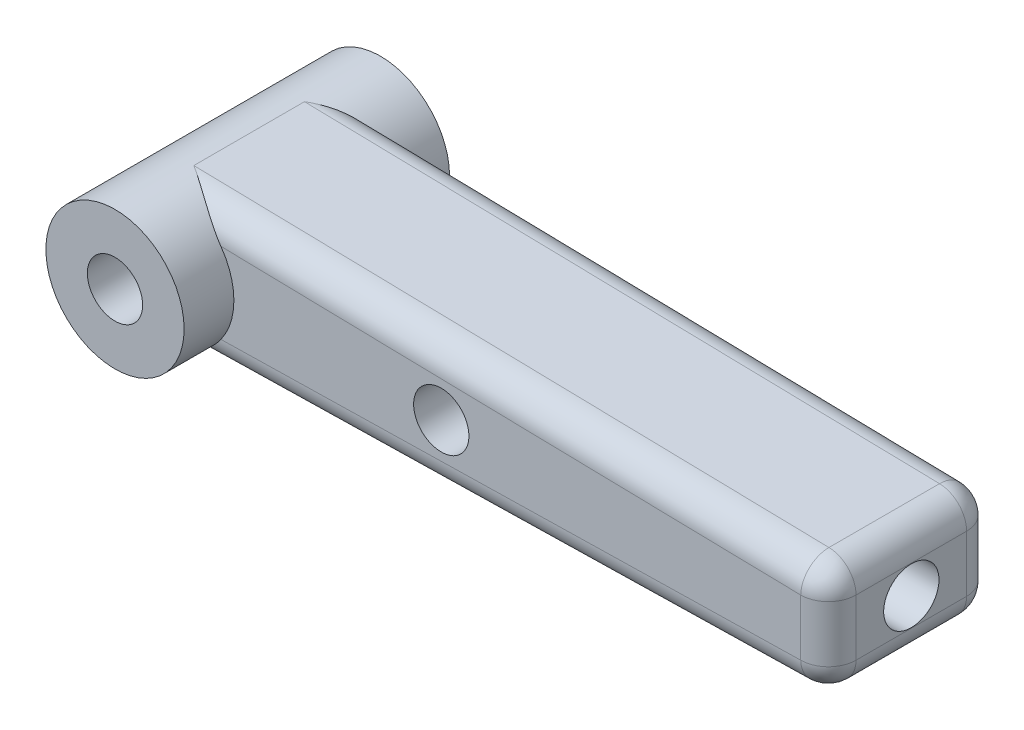
ISO-10303-21;
HEADER;
FILE_DESCRIPTION(('STEP AP214'),'2;1');
FILE_NAME('part.step','',(''),(''),'','','');
FILE_SCHEMA(('AUTOMOTIVE_DESIGN { 1 0 10303 214 1 1 1 1 }'));
ENDSEC;
DATA;
#1=APPLICATION_CONTEXT('core data for automotive mechanical design processes');
#2=APPLICATION_PROTOCOL_DEFINITION('international standard','automotive_design',2000,#1);
#3=PRODUCT_CONTEXT('',#1,'mechanical');
#4=PRODUCT('Part','Part','',(#3));
#5=PRODUCT_RELATED_PRODUCT_CATEGORY('part','',(#4));
#6=PRODUCT_DEFINITION_FORMATION('','',#4);
#7=PRODUCT_DEFINITION_CONTEXT('part definition',#1,'design');
#8=PRODUCT_DEFINITION('design','',#6,#7);
#9=PRODUCT_DEFINITION_SHAPE('','',#8);
#10=(LENGTH_UNIT() NAMED_UNIT(*) SI_UNIT(.MILLI.,.METRE.));
#11=(NAMED_UNIT(*) PLANE_ANGLE_UNIT() SI_UNIT($,.RADIAN.));
#12=(NAMED_UNIT(*) SI_UNIT($,.STERADIAN.) SOLID_ANGLE_UNIT());
#13=UNCERTAINTY_MEASURE_WITH_UNIT(LENGTH_MEASURE(1.E-05),#10,'distance_accuracy_value','');
#14=(GEOMETRIC_REPRESENTATION_CONTEXT(3) GLOBAL_UNCERTAINTY_ASSIGNED_CONTEXT((#13)) GLOBAL_UNIT_ASSIGNED_CONTEXT((#10,
#11,#12)) REPRESENTATION_CONTEXT('',''));
#15=CARTESIAN_POINT('',(0.,0.,0.));
#16=DIRECTION('',(0.,0.,1.));
#17=DIRECTION('',(1.,0.,0.));
#18=AXIS2_PLACEMENT_3D('',#15,#16,#17);
#19=CARTESIAN_POINT('',(0.,0.,4.8));
#20=DIRECTION('',(0.,0.,1.));
#21=DIRECTION('',(1.,0.,0.));
#22=AXIS2_PLACEMENT_3D('',#19,#20,#21);
#23=PLANE('',#22);
#24=CARTESIAN_POINT('',(0.,0.,4.8));
#25=DIRECTION('',(0.,0.,1.));
#26=DIRECTION('',(1.,0.,0.));
#27=AXIS2_PLACEMENT_3D('',#24,#25,#26);
#28=CIRCLE('',#27,1.25);
#29=CARTESIAN_POINT('',(1.25,0.,4.8));
#30=VERTEX_POINT('',#29);
#31=EDGE_CURVE('E277',#30,#30,#28,.T.);
#32=ORIENTED_EDGE('',*,*,#31,.T.);
#33=EDGE_LOOP('',(#32));
#34=FACE_BOUND('',#33,.T.);
#35=CARTESIAN_POINT('',(0.,0.,4.8));
#36=DIRECTION('',(0.,0.,1.));
#37=DIRECTION('',(1.,0.,0.));
#38=AXIS2_PLACEMENT_3D('',#35,#36,#37);
#39=CIRCLE('',#38,0.5);
#40=CARTESIAN_POINT('',(0.5,0.,4.8));
#41=VERTEX_POINT('',#40);
#42=EDGE_CURVE('E271',#41,#41,#39,.T.);
#43=ORIENTED_EDGE('',*,*,#42,.F.);
#44=EDGE_LOOP('',(#43));
#45=FACE_BOUND('',#44,.T.);
#46=ADVANCED_FACE('F35',(#34,#45),#23,.T.);
#47=CARTESIAN_POINT('',(0.,0.,0.));
#48=DIRECTION('',(0.,0.,1.));
#49=DIRECTION('',(1.,0.,0.));
#50=AXIS2_PLACEMENT_3D('',#47,#48,#49);
#51=PLANE('',#50);
#52=CARTESIAN_POINT('',(0.,0.,0.));
#53=DIRECTION('',(0.,0.,1.));
#54=DIRECTION('',(1.,0.,0.));
#55=AXIS2_PLACEMENT_3D('',#52,#53,#54);
#56=CIRCLE('',#55,1.25);
#57=CARTESIAN_POINT('',(1.25,0.,0.));
#58=VERTEX_POINT('',#57);
#59=EDGE_CURVE('E274',#58,#58,#56,.T.);
#60=ORIENTED_EDGE('',*,*,#59,.F.);
#61=EDGE_LOOP('',(#60));
#62=FACE_BOUND('',#61,.T.);
#63=CARTESIAN_POINT('',(0.,0.,0.));
#64=DIRECTION('',(0.,0.,1.));
#65=DIRECTION('',(1.,0.,0.));
#66=AXIS2_PLACEMENT_3D('',#63,#64,#65);
#67=CIRCLE('',#66,0.5);
#68=CARTESIAN_POINT('',(0.5,0.,0.));
#69=VERTEX_POINT('',#68);
#70=EDGE_CURVE('E270',#69,#69,#67,.T.);
#71=ORIENTED_EDGE('',*,*,#70,.T.);
#72=EDGE_LOOP('',(#71));
#73=FACE_BOUND('',#72,.T.);
#74=ADVANCED_FACE('F181',(#62,#73),#51,.F.);
#75=CARTESIAN_POINT('',(0.,0.,4.8));
#76=DIRECTION('',(0.,0.,-1.));
#77=DIRECTION('',(-1.,0.,0.));
#78=AXIS2_PLACEMENT_3D('',#75,#76,#77);
#79=CYLINDRICAL_SURFACE('',#78,1.25);
#80=DIRECTION('',(0.,0.,-1.));
#81=VECTOR('',#80,1.);
#82=CARTESIAN_POINT('',(0.0260870355616263,-1.24972775698374,3.9));
#83=LINE('',#82,#81);
#84=CARTESIAN_POINT('',(0.0260870355616263,-1.24972775698374,3.4));
#85=VERTEX_POINT('',#84);
#86=CARTESIAN_POINT('',(0.0260870355616263,-1.24972775698374,1.4));
#87=VERTEX_POINT('',#86);
#88=EDGE_CURVE('E267',#85,#87,#83,.T.);
#89=ORIENTED_EDGE('',*,*,#88,.F.);
#90=CARTESIAN_POINT('',(1.01543442692397,-0.728967025740943,3.9));
#91=CARTESIAN_POINT('',(0.990487316357361,-0.763772217027113,3.89995437798311));
#92=CARTESIAN_POINT('',(0.963842256000948,-0.797064434923558,3.89648947316909));
#93=CARTESIAN_POINT('',(0.908144860456212,-0.859940345698636,3.88417199961452));
#94=CARTESIAN_POINT('',(0.879118613402191,-0.889557119876381,3.87537244698735));
#95=CARTESIAN_POINT('',(0.806402745746041,-0.95687905416219,3.8491996753431));
#96=CARTESIAN_POINT('',(0.761717911251992,-0.99268274761262,3.82977274363563));
#97=CARTESIAN_POINT('',(0.669593458560683,-1.05703624217394,3.78545289950944));
#98=CARTESIAN_POINT('',(0.622138579963876,-1.08554004774956,3.76052708576459));
#99=CARTESIAN_POINT('',(0.505517030929491,-1.14580542201982,3.69606540788161));
#100=CARTESIAN_POINT('',(0.435503676909903,-1.17402052720388,3.65475605751677));
#101=CARTESIAN_POINT('',(0.293880977589179,-1.21721305299757,3.56866123954941));
#102=CARTESIAN_POINT('',(0.222274788373728,-1.23221461084458,3.5238822734504));
#103=CARTESIAN_POINT('',(0.110987178605643,-1.24569201529465,3.45372956917905));
#104=CARTESIAN_POINT('',(0.0715411580139974,-1.24857582900554,3.42875629157539));
#105=CARTESIAN_POINT('',(0.0300701518355206,-1.24963984834981,3.4025197568753));
#106=CARTESIAN_POINT('',(0.0280786320890607,-1.24968618216525,3.40125987198878));
#107=CARTESIAN_POINT('',(0.0260870355616263,-1.24972775698374,3.4));
#108=B_SPLINE_CURVE_WITH_KNOTS('',3,(#90,#91,#92,#93,#94,#95,#96,#97,#98,#99,#100,#101,#102,
#103,#104,#105,#106,#107),.UNSPECIFIED.,.F.,.F.,(4,2,2,2,2,2,2,2,4),(0.,0.127924797823653,
0.254598647117404,0.435030959010438,0.6165736310556,0.873361822738004,1.12967995978447,
1.2698619824188,1.27693306466165),.UNSPECIFIED.);
#109=CARTESIAN_POINT('',(1.01543442692397,-0.728967025740943,3.9));
#110=VERTEX_POINT('',#109);
#111=EDGE_CURVE('E135',#85,#110,#108,.F.);
#112=ORIENTED_EDGE('',*,*,#111,.T.);
#113=CARTESIAN_POINT('',(0.,0.,3.9));
#114=DIRECTION('',(0.,0.,-1.));
#115=DIRECTION('',(1.,0.,0.));
#116=AXIS2_PLACEMENT_3D('',#113,#114,#115);
#117=CIRCLE('',#116,1.25);
#118=CARTESIAN_POINT('',(1.01543442692397,0.728967025740943,3.9));
#119=VERTEX_POINT('',#118);
#120=EDGE_CURVE('E118',#119,#110,#117,.T.);
#121=ORIENTED_EDGE('',*,*,#120,.F.);
#122=CARTESIAN_POINT('',(1.01543442692397,0.728967025740943,3.9));
#123=CARTESIAN_POINT('',(0.990487316357361,0.763772217027113,3.89995437798311));
#124=CARTESIAN_POINT('',(0.963842256000948,0.797064434923558,3.89648947316909));
#125=CARTESIAN_POINT('',(0.908144860456212,0.859940345698636,3.88417199961451));
#126=CARTESIAN_POINT('',(0.879118613402191,0.889557119876381,3.87537244698735));
#127=CARTESIAN_POINT('',(0.806402745746041,0.95687905416219,3.8491996753431));
#128=CARTESIAN_POINT('',(0.761717911251991,0.99268274761262,3.82977274363563));
#129=CARTESIAN_POINT('',(0.669593458560683,1.05703624217394,3.78545289950944));
#130=CARTESIAN_POINT('',(0.622138579963876,1.08554004774956,3.76052708576459));
#131=CARTESIAN_POINT('',(0.505517030929491,1.14580542201982,3.69606540788161));
#132=CARTESIAN_POINT('',(0.435503676909902,1.17402052720388,3.65475605751677));
#133=CARTESIAN_POINT('',(0.293880977589179,1.21721305299757,3.56866123954941));
#134=CARTESIAN_POINT('',(0.222274788373729,1.23221461084458,3.52388227345039));
#135=CARTESIAN_POINT('',(0.110987178605642,1.24569201529465,3.45372956917905));
#136=CARTESIAN_POINT('',(0.0715411580139957,1.24857582900554,3.4287562915754));
#137=CARTESIAN_POINT('',(0.0300701518355204,1.24963984834981,3.4025197568753));
#138=CARTESIAN_POINT('',(0.0280786320890607,1.24968618216525,3.40125987198878));
#139=CARTESIAN_POINT('',(0.0260870355616263,1.24972775698374,3.4));
#140=B_SPLINE_CURVE_WITH_KNOTS('',3,(#122,#123,#124,#125,#126,#127,#128,#129,#130,#131,#132,
#133,#134,#135,#136,#137,#138,#139),.UNSPECIFIED.,.F.,.F.,(4,2,2,2,2,2,2,2,4),(0.,
0.127924797823653,0.254598647117404,0.435030959010438,0.6165736310556,0.873361822738004,
1.12967995978447,1.2698619824188,1.27693306466165),.UNSPECIFIED.);
#141=CARTESIAN_POINT('',(0.0260870355616263,1.24972775698374,3.4));
#142=VERTEX_POINT('',#141);
#143=EDGE_CURVE('E11',#119,#142,#140,.T.);
#144=ORIENTED_EDGE('',*,*,#143,.T.);
#145=DIRECTION('',(0.,0.,-1.));
#146=VECTOR('',#145,1.);
#147=CARTESIAN_POINT('',(0.0260870355616263,1.24972775698374,3.9));
#148=LINE('',#147,#146);
#149=CARTESIAN_POINT('',(0.0260870355616263,1.24972775698374,1.4));
#150=VERTEX_POINT('',#149);
#151=EDGE_CURVE('E136',#142,#150,#148,.T.);
#152=ORIENTED_EDGE('',*,*,#151,.T.);
#153=CARTESIAN_POINT('',(1.01543442692397,0.728967025740943,0.9));
#154=CARTESIAN_POINT('',(0.990487316357361,0.763772217027113,0.900045622016887));
#155=CARTESIAN_POINT('',(0.963842256000948,0.797064434923558,0.903510526830907));
#156=CARTESIAN_POINT('',(0.908144860456212,0.859940345698636,0.915828000385484));
#157=CARTESIAN_POINT('',(0.879118613402191,0.889557119876381,0.924627553012651));
#158=CARTESIAN_POINT('',(0.806402745746041,0.95687905416219,0.950800324656898));
#159=CARTESIAN_POINT('',(0.761717911251991,0.99268274761262,0.970227256364368));
#160=CARTESIAN_POINT('',(0.669593458560683,1.05703624217394,1.01454710049056));
#161=CARTESIAN_POINT('',(0.622138579963876,1.08554004774956,1.03947291423541));
#162=CARTESIAN_POINT('',(0.505517030929491,1.14580542201982,1.10393459211839));
#163=CARTESIAN_POINT('',(0.435503676909901,1.17402052720388,1.14524394248323));
#164=CARTESIAN_POINT('',(0.29388097758918,1.21721305299757,1.23133876045059));
#165=CARTESIAN_POINT('',(0.222274788373731,1.23221461084458,1.27611772654961));
#166=CARTESIAN_POINT('',(0.110987178605641,1.24569201529465,1.34627043082094));
#167=CARTESIAN_POINT('',(0.0715411580139914,1.24857582900554,1.3712437084246));
#168=CARTESIAN_POINT('',(0.0300701518355199,1.24963984834981,1.3974802431247));
#169=CARTESIAN_POINT('',(0.0280786320890604,1.24968618216525,1.39874012801122));
#170=CARTESIAN_POINT('',(0.0260870355616263,1.24972775698374,1.4));
#171=B_SPLINE_CURVE_WITH_KNOTS('',3,(#153,#154,#155,#156,#157,#158,#159,#160,#161,#162,#163,
#164,#165,#166,#167,#168,#169,#170),.UNSPECIFIED.,.F.,.F.,(4,2,2,2,2,2,2,2,4),(0.,
0.127924797823653,0.254598647117404,0.435030959010438,0.6165736310556,0.873361822738004,
1.12967995978447,1.2698619824188,1.27693306466165),.UNSPECIFIED.);
#172=CARTESIAN_POINT('',(1.01543442692397,0.728967025740943,0.9));
#173=VERTEX_POINT('',#172);
#174=EDGE_CURVE('E45',#150,#173,#171,.F.);
#175=ORIENTED_EDGE('',*,*,#174,.T.);
#176=CARTESIAN_POINT('',(0.,0.,0.9));
#177=DIRECTION('',(0.,0.,-1.));
#178=DIRECTION('',(1.,0.,0.));
#179=AXIS2_PLACEMENT_3D('',#176,#177,#178);
#180=CIRCLE('',#179,1.25);
#181=CARTESIAN_POINT('',(1.01543442692397,-0.728967025740943,0.9));
#182=VERTEX_POINT('',#181);
#183=EDGE_CURVE('E137',#173,#182,#180,.T.);
#184=ORIENTED_EDGE('',*,*,#183,.T.);
#185=CARTESIAN_POINT('',(1.01543442692397,-0.728967025740943,0.9));
#186=CARTESIAN_POINT('',(0.990487316357361,-0.763772217027113,0.900045622016887));
#187=CARTESIAN_POINT('',(0.963842256000948,-0.797064434923558,0.903510526830907));
#188=CARTESIAN_POINT('',(0.908144860456212,-0.859940345698636,0.915828000385484));
#189=CARTESIAN_POINT('',(0.879118613402191,-0.889557119876381,0.924627553012651));
#190=CARTESIAN_POINT('',(0.806402745746041,-0.95687905416219,0.950800324656898));
#191=CARTESIAN_POINT('',(0.761717911251991,-0.99268274761262,0.970227256364368));
#192=CARTESIAN_POINT('',(0.669593458560683,-1.05703624217394,1.01454710049056));
#193=CARTESIAN_POINT('',(0.622138579963876,-1.08554004774956,1.03947291423541));
#194=CARTESIAN_POINT('',(0.505517030929491,-1.14580542201982,1.10393459211839));
#195=CARTESIAN_POINT('',(0.435503676909901,-1.17402052720388,1.14524394248323));
#196=CARTESIAN_POINT('',(0.29388097758918,-1.21721305299757,1.23133876045059));
#197=CARTESIAN_POINT('',(0.222274788373731,-1.23221461084458,1.27611772654961));
#198=CARTESIAN_POINT('',(0.110987178605641,-1.24569201529465,1.34627043082094));
#199=CARTESIAN_POINT('',(0.0715411580139914,-1.24857582900554,1.3712437084246));
#200=CARTESIAN_POINT('',(0.0300701518355199,-1.24963984834981,1.3974802431247));
#201=CARTESIAN_POINT('',(0.0280786320890604,-1.24968618216525,1.39874012801122));
#202=CARTESIAN_POINT('',(0.0260870355616263,-1.24972775698374,1.4));
#203=B_SPLINE_CURVE_WITH_KNOTS('',3,(#185,#186,#187,#188,#189,#190,#191,#192,#193,#194,#195,
#196,#197,#198,#199,#200,#201,#202),.UNSPECIFIED.,.F.,.F.,(4,2,2,2,2,2,2,2,4),(0.,
0.127924797823653,0.254598647117404,0.435030959010438,0.6165736310556,0.873361822738004,
1.12967995978447,1.2698619824188,1.27693306466165),.UNSPECIFIED.);
#204=EDGE_CURVE('E167',#182,#87,#203,.T.);
#205=ORIENTED_EDGE('',*,*,#204,.T.);
#206=EDGE_LOOP('',(#89,#112,#121,#144,#152,#175,#184,#205));
#207=FACE_BOUND('',#206,.T.);
#208=ORIENTED_EDGE('',*,*,#31,.F.);
#209=EDGE_LOOP('',(#208));
#210=FACE_BOUND('',#209,.T.);
#211=ORIENTED_EDGE('',*,*,#59,.T.);
#212=EDGE_LOOP('',(#211));
#213=FACE_BOUND('',#212,.T.);
#214=ADVANCED_FACE('F130',(#207,#210,#213),#79,.T.);
#215=CARTESIAN_POINT('',(0.,0.,4.8));
#216=DIRECTION('',(0.,0.,-1.));
#217=DIRECTION('',(-1.,0.,0.));
#218=AXIS2_PLACEMENT_3D('',#215,#216,#217);
#219=CYLINDRICAL_SURFACE('',#218,0.5);
#220=ORIENTED_EDGE('',*,*,#42,.T.);
#221=EDGE_LOOP('',(#220));
#222=FACE_BOUND('',#221,.T.);
#223=ORIENTED_EDGE('',*,*,#70,.F.);
#224=EDGE_LOOP('',(#223));
#225=FACE_BOUND('',#224,.T.);
#226=ADVANCED_FACE('F180',(#222,#225),#219,.F.);
#227=CARTESIAN_POINT('',(0.0260870355616263,-1.24972775698374,3.9));
#228=DIRECTION('',(-0.020869628449301,0.999782205586991,0.));
#229=DIRECTION('',(-0.999782205586991,-0.0208696284493011,0.));
#230=AXIS2_PLACEMENT_3D('',#227,#228,#229);
#231=PLANE('',#230);
#232=DIRECTION('',(0.,0.,-1.));
#233=VECTOR('',#232,1.);
#234=CARTESIAN_POINT('',(11.5104348142247,-1.01000147481558,3.9));
#235=LINE('',#234,#233);
#236=CARTESIAN_POINT('',(11.5104348142247,-1.01000147481558,1.4));
#237=VERTEX_POINT('',#236);
#238=CARTESIAN_POINT('',(11.5104348142247,-1.01000147481558,3.4));
#239=VERTEX_POINT('',#238);
#240=EDGE_CURVE('E285',#237,#239,#235,.F.);
#241=ORIENTED_EDGE('',*,*,#240,.T.);
#242=DIRECTION('',(0.999782205586991,0.0208696284493011,0.));
#243=VECTOR('',#242,1.);
#244=CARTESIAN_POINT('',(0.0260870355616263,-1.24972775698374,3.4));
#245=LINE('',#244,#243);
#246=EDGE_CURVE('E289',#239,#85,#245,.F.);
#247=ORIENTED_EDGE('',*,*,#246,.T.);
#248=ORIENTED_EDGE('',*,*,#88,.T.);
#249=DIRECTION('',(0.999782205586991,0.0208696284493011,0.));
#250=VECTOR('',#249,1.);
#251=CARTESIAN_POINT('',(0.0260870355616263,-1.24972775698374,1.4));
#252=LINE('',#251,#250);
#253=EDGE_CURVE('E287',#87,#237,#252,.T.);
#254=ORIENTED_EDGE('',*,*,#253,.T.);
#255=EDGE_LOOP('',(#241,#247,#248,#254));
#256=FACE_BOUND('',#255,.T.);
#257=ADVANCED_FACE('F223',(#256),#231,.F.);
#258=CARTESIAN_POINT('',(12.,0.999782205586991,3.9));
#259=DIRECTION('',(-1.,0.,0.));
#260=DIRECTION('',(0.,0.,1.));
#261=AXIS2_PLACEMENT_3D('',#258,#259,#260);
#262=PLANE('',#261);
#263=DIRECTION('',(0.,1.,0.));
#264=VECTOR('',#263,1.);
#265=CARTESIAN_POINT('',(12.,-0.999782205586991,3.4));
#266=LINE('',#265,#264);
#267=CARTESIAN_POINT('',(12.,0.510110372022083,3.4));
#268=VERTEX_POINT('',#267);
#269=CARTESIAN_POINT('',(12.,-0.510110372022083,3.4));
#270=VERTEX_POINT('',#269);
#271=EDGE_CURVE('E58',#268,#270,#266,.F.);
#272=ORIENTED_EDGE('',*,*,#271,.T.);
#273=DIRECTION('',(0.,0.,-1.));
#274=VECTOR('',#273,1.);
#275=CARTESIAN_POINT('',(12.,-0.510110372022083,3.9));
#276=LINE('',#275,#274);
#277=CARTESIAN_POINT('',(12.,-0.510110372022083,1.4));
#278=VERTEX_POINT('',#277);
#279=EDGE_CURVE('E53',#270,#278,#276,.T.);
#280=ORIENTED_EDGE('',*,*,#279,.T.);
#281=DIRECTION('',(0.,1.,0.));
#282=VECTOR('',#281,1.);
#283=CARTESIAN_POINT('',(12.,0.999782205586991,1.4));
#284=LINE('',#283,#282);
#285=CARTESIAN_POINT('',(12.,0.510110372022083,1.4));
#286=VERTEX_POINT('',#285);
#287=EDGE_CURVE('E157',#278,#286,#284,.T.);
#288=ORIENTED_EDGE('',*,*,#287,.T.);
#289=DIRECTION('',(0.,0.,-1.));
#290=VECTOR('',#289,1.);
#291=CARTESIAN_POINT('',(12.,0.510110372022083,3.9));
#292=LINE('',#291,#290);
#293=EDGE_CURVE('E149',#286,#268,#292,.F.);
#294=ORIENTED_EDGE('',*,*,#293,.T.);
#295=EDGE_LOOP('',(#272,#280,#288,#294));
#296=FACE_BOUND('',#295,.T.);
#297=CARTESIAN_POINT('',(12.,0.,2.4));
#298=DIRECTION('',(1.,0.,0.));
#299=DIRECTION('',(0.,0.,-1.));
#300=AXIS2_PLACEMENT_3D('',#297,#298,#299);
#301=CIRCLE('',#300,0.5);
#302=CARTESIAN_POINT('',(12.,0.,1.9));
#303=VERTEX_POINT('',#302);
#304=EDGE_CURVE('E256',#303,#303,#301,.T.);
#305=ORIENTED_EDGE('',*,*,#304,.F.);
#306=EDGE_LOOP('',(#305));
#307=FACE_BOUND('',#306,.T.);
#308=ADVANCED_FACE('F227',(#296,#307),#262,.F.);
#309=CARTESIAN_POINT('',(0.0260870355616263,1.24972775698374,3.9));
#310=DIRECTION('',(-0.020869628449301,-0.999782205586991,0.));
#311=DIRECTION('',(0.999782205586991,-0.0208696284493011,0.));
#312=AXIS2_PLACEMENT_3D('',#309,#310,#311);
#313=PLANE('',#312);
#314=DIRECTION('',(0.,0.,-1.));
#315=VECTOR('',#314,1.);
#316=CARTESIAN_POINT('',(11.5104348142247,1.01000147481558,3.9));
#317=LINE('',#316,#315);
#318=CARTESIAN_POINT('',(11.5104348142247,1.01000147481558,3.4));
#319=VERTEX_POINT('',#318);
#320=CARTESIAN_POINT('',(11.5104348142247,1.01000147481558,1.4));
#321=VERTEX_POINT('',#320);
#322=EDGE_CURVE('E147',#319,#321,#317,.T.);
#323=ORIENTED_EDGE('',*,*,#322,.T.);
#324=DIRECTION('',(-0.999782205586991,0.0208696284493011,0.));
#325=VECTOR('',#324,1.);
#326=CARTESIAN_POINT('',(0.0260870355616263,1.24972775698374,1.4));
#327=LINE('',#326,#325);
#328=EDGE_CURVE('E146',#321,#150,#327,.T.);
#329=ORIENTED_EDGE('',*,*,#328,.T.);
#330=ORIENTED_EDGE('',*,*,#151,.F.);
#331=DIRECTION('',(-0.999782205586991,0.0208696284493011,0.));
#332=VECTOR('',#331,1.);
#333=CARTESIAN_POINT('',(12.,0.999782205586991,3.4));
#334=LINE('',#333,#332);
#335=EDGE_CURVE('E141',#142,#319,#334,.F.);
#336=ORIENTED_EDGE('',*,*,#335,.T.);
#337=EDGE_LOOP('',(#323,#329,#330,#336));
#338=FACE_BOUND('',#337,.T.);
#339=ADVANCED_FACE('F231',(#338),#313,.F.);
#340=CARTESIAN_POINT('',(0.,0.,3.9));
#341=DIRECTION('',(0.,0.,1.));
#342=DIRECTION('',(1.,0.,0.));
#343=AXIS2_PLACEMENT_3D('',#340,#341,#342);
#344=PLANE('',#343);
#345=ORIENTED_EDGE('',*,*,#120,.T.);
#346=DIRECTION('',(0.999782205586991,0.0208696284493011,0.));
#347=VECTOR('',#346,1.);
#348=CARTESIAN_POINT('',(11.9895651857754,-0.499891102793496,3.9));
#349=LINE('',#348,#347);
#350=CARTESIAN_POINT('',(11.5,-0.510110372022083,3.9));
#351=VERTEX_POINT('',#350);
#352=EDGE_CURVE('E126',#110,#351,#349,.T.);
#353=ORIENTED_EDGE('',*,*,#352,.T.);
#354=DIRECTION('',(0.,1.,0.));
#355=VECTOR('',#354,1.);
#356=CARTESIAN_POINT('',(11.5,0.999782205586991,3.9));
#357=LINE('',#356,#355);
#358=CARTESIAN_POINT('',(11.5,0.510110372022083,3.9));
#359=VERTEX_POINT('',#358);
#360=EDGE_CURVE('E121',#351,#359,#357,.T.);
#361=ORIENTED_EDGE('',*,*,#360,.T.);
#362=DIRECTION('',(-0.999782205586991,0.0208696284493011,0.));
#363=VECTOR('',#362,1.);
#364=CARTESIAN_POINT('',(0.0156522213369758,0.749836654190244,3.9));
#365=LINE('',#364,#363);
#366=EDGE_CURVE('E113',#359,#119,#365,.T.);
#367=ORIENTED_EDGE('',*,*,#366,.T.);
#368=EDGE_LOOP('',(#345,#353,#361,#367));
#369=FACE_BOUND('',#368,.T.);
#370=CARTESIAN_POINT('',(5.,0.,3.9));
#371=DIRECTION('',(0.,0.,1.));
#372=DIRECTION('',(1.,0.,0.));
#373=AXIS2_PLACEMENT_3D('',#370,#371,#372);
#374=CIRCLE('',#373,0.5);
#375=CARTESIAN_POINT('',(5.5,0.,3.9));
#376=VERTEX_POINT('',#375);
#377=EDGE_CURVE('E255',#376,#376,#374,.T.);
#378=ORIENTED_EDGE('',*,*,#377,.F.);
#379=EDGE_LOOP('',(#378));
#380=FACE_BOUND('',#379,.T.);
#381=ADVANCED_FACE('F115',(#369,#380),#344,.T.);
#382=CARTESIAN_POINT('',(0.,0.,0.9));
#383=DIRECTION('',(0.,0.,1.));
#384=DIRECTION('',(1.,0.,0.));
#385=AXIS2_PLACEMENT_3D('',#382,#383,#384);
#386=PLANE('',#385);
#387=CARTESIAN_POINT('',(5.,0.,0.9));
#388=DIRECTION('',(0.,0.,1.));
#389=DIRECTION('',(1.,0.,0.));
#390=AXIS2_PLACEMENT_3D('',#387,#388,#389);
#391=CIRCLE('',#390,0.5);
#392=CARTESIAN_POINT('',(5.5,0.,0.9));
#393=VERTEX_POINT('',#392);
#394=EDGE_CURVE('E259',#393,#393,#391,.T.);
#395=ORIENTED_EDGE('',*,*,#394,.T.);
#396=EDGE_LOOP('',(#395));
#397=FACE_BOUND('',#396,.T.);
#398=DIRECTION('',(0.,1.,0.));
#399=VECTOR('',#398,1.);
#400=CARTESIAN_POINT('',(11.5,0.,0.9));
#401=LINE('',#400,#399);
#402=CARTESIAN_POINT('',(11.5,0.510110372022083,0.9));
#403=VERTEX_POINT('',#402);
#404=CARTESIAN_POINT('',(11.5,-0.510110372022083,0.9));
#405=VERTEX_POINT('',#404);
#406=EDGE_CURVE('E291',#403,#405,#401,.F.);
#407=ORIENTED_EDGE('',*,*,#406,.T.);
#408=DIRECTION('',(0.999782205586991,0.0208696284493011,0.));
#409=VECTOR('',#408,1.);
#410=CARTESIAN_POINT('',(0.0156522213369758,-0.749836654190244,0.9));
#411=LINE('',#410,#409);
#412=EDGE_CURVE('E151',#405,#182,#411,.F.);
#413=ORIENTED_EDGE('',*,*,#412,.T.);
#414=ORIENTED_EDGE('',*,*,#183,.F.);
#415=DIRECTION('',(-0.999782205586991,0.0208696284493011,0.));
#416=VECTOR('',#415,1.);
#417=CARTESIAN_POINT('',(0.0156522213369758,0.749836654190244,0.9));
#418=LINE('',#417,#416);
#419=EDGE_CURVE('E293',#173,#403,#418,.F.);
#420=ORIENTED_EDGE('',*,*,#419,.T.);
#421=EDGE_LOOP('',(#407,#413,#414,#420));
#422=FACE_BOUND('',#421,.T.);
#423=ADVANCED_FACE('F234',(#397,#422),#386,.F.);
#424=CARTESIAN_POINT('',(5.,0.,-6.1));
#425=DIRECTION('',(0.,0.,1.));
#426=DIRECTION('',(1.,0.,0.));
#427=AXIS2_PLACEMENT_3D('',#424,#425,#426);
#428=CYLINDRICAL_SURFACE('',#427,0.5);
#429=ORIENTED_EDGE('',*,*,#377,.T.);
#430=EDGE_LOOP('',(#429));
#431=FACE_BOUND('',#430,.T.);
#432=ORIENTED_EDGE('',*,*,#394,.F.);
#433=EDGE_LOOP('',(#432));
#434=FACE_BOUND('',#433,.T.);
#435=ADVANCED_FACE('F237',(#431,#434),#428,.F.);
#436=CARTESIAN_POINT('',(7.,0.,2.4));
#437=DIRECTION('',(1.,0.,0.));
#438=DIRECTION('',(0.,0.,-1.));
#439=AXIS2_PLACEMENT_3D('',#436,#437,#438);
#440=CYLINDRICAL_SURFACE('',#439,0.5);
#441=CARTESIAN_POINT('',(7.,0.,2.4));
#442=DIRECTION('',(1.,0.,0.));
#443=DIRECTION('',(0.,0.,-1.));
#444=AXIS2_PLACEMENT_3D('',#441,#442,#443);
#445=CIRCLE('',#444,0.5);
#446=CARTESIAN_POINT('',(7.,0.,1.9));
#447=VERTEX_POINT('',#446);
#448=EDGE_CURVE('E254',#447,#447,#445,.T.);
#449=ORIENTED_EDGE('',*,*,#448,.F.);
#450=EDGE_LOOP('',(#449));
#451=FACE_BOUND('',#450,.T.);
#452=ORIENTED_EDGE('',*,*,#304,.T.);
#453=EDGE_LOOP('',(#452));
#454=FACE_BOUND('',#453,.T.);
#455=ADVANCED_FACE('F243',(#451,#454),#440,.F.);
#456=CARTESIAN_POINT('',(7.,0.,2.4));
#457=DIRECTION('',(1.,0.,0.));
#458=DIRECTION('',(0.,0.,-1.));
#459=AXIS2_PLACEMENT_3D('',#456,#457,#458);
#460=PLANE('',#459);
#461=ORIENTED_EDGE('',*,*,#448,.T.);
#462=EDGE_LOOP('',(#461));
#463=FACE_BOUND('',#462,.T.);
#464=ADVANCED_FACE('F209',(#463),#460,.T.);
#465=CARTESIAN_POINT('',(0.0156522213369757,0.749836654190244,1.4));
#466=DIRECTION('',(-0.999782205586991,0.0208696284493011,0.));
#467=DIRECTION('',(-0.0208696284493011,-0.999782205586991,0.));
#468=AXIS2_PLACEMENT_3D('',#465,#466,#467);
#469=CYLINDRICAL_SURFACE('',#468,0.5);
#470=CARTESIAN_POINT('',(11.5,0.510110372022083,1.4));
#471=DIRECTION('',(0.999782205586991,-0.0208696284493028,0.));
#472=DIRECTION('',(0.0208696284493028,0.999782205586991,0.));
#473=AXIS2_PLACEMENT_3D('',#470,#471,#472);
#474=CIRCLE('',#473,0.5);
#475=EDGE_CURVE('E40',#403,#321,#474,.T.);
#476=ORIENTED_EDGE('',*,*,#475,.F.);
#477=ORIENTED_EDGE('',*,*,#419,.F.);
#478=ORIENTED_EDGE('',*,*,#174,.F.);
#479=ORIENTED_EDGE('',*,*,#328,.F.);
#480=EDGE_LOOP('',(#476,#477,#478,#479));
#481=FACE_BOUND('',#480,.T.);
#482=ADVANCED_FACE('F37',(#481),#469,.T.);
#483=CARTESIAN_POINT('',(11.5,0.510110372022083,1.4));
#484=DIRECTION('',(0.,0.,-1.));
#485=DIRECTION('',(-1.,0.,0.));
#486=AXIS2_PLACEMENT_3D('',#483,#484,#485);
#487=SPHERICAL_SURFACE('',#486,0.5);
#488=CARTESIAN_POINT('',(11.5,0.510110372022083,1.4));
#489=DIRECTION('',(0.,1.,0.));
#490=DIRECTION('',(0.,0.,1.));
#491=AXIS2_PLACEMENT_3D('',#488,#489,#490);
#492=CIRCLE('',#491,0.5);
#493=EDGE_CURVE('E340',#403,#286,#492,.F.);
#494=ORIENTED_EDGE('',*,*,#493,.F.);
#495=ORIENTED_EDGE('',*,*,#475,.T.);
#496=CARTESIAN_POINT('',(11.5,0.510110372022083,1.4));
#497=DIRECTION('',(0.,0.,-1.));
#498=DIRECTION('',(-1.,0.,0.));
#499=AXIS2_PLACEMENT_3D('',#496,#497,#498);
#500=CIRCLE('',#499,0.5);
#501=EDGE_CURVE('E342',#286,#321,#500,.F.);
#502=ORIENTED_EDGE('',*,*,#501,.F.);
#503=EDGE_LOOP('',(#494,#495,#502));
#504=FACE_BOUND('',#503,.T.);
#505=ADVANCED_FACE('F202',(#504),#487,.T.);
#506=CARTESIAN_POINT('',(0.0156522213369758,0.749836654190244,3.4));
#507=DIRECTION('',(0.999782205586991,-0.0208696284493011,0.));
#508=DIRECTION('',(0.0208696284493011,0.999782205586991,0.));
#509=AXIS2_PLACEMENT_3D('',#506,#507,#508);
#510=CYLINDRICAL_SURFACE('',#509,0.5);
#511=ORIENTED_EDGE('',*,*,#143,.F.);
#512=ORIENTED_EDGE('',*,*,#366,.F.);
#513=CARTESIAN_POINT('',(11.5,0.510110372022083,3.4));
#514=DIRECTION('',(0.999782205586991,-0.0208696284493028,0.));
#515=DIRECTION('',(0.0208696284493028,0.999782205586991,0.));
#516=AXIS2_PLACEMENT_3D('',#513,#514,#515);
#517=CIRCLE('',#516,0.5);
#518=EDGE_CURVE('E142',#319,#359,#517,.T.);
#519=ORIENTED_EDGE('',*,*,#518,.F.);
#520=ORIENTED_EDGE('',*,*,#335,.F.);
#521=EDGE_LOOP('',(#511,#512,#519,#520));
#522=FACE_BOUND('',#521,.T.);
#523=ADVANCED_FACE('F140',(#522),#510,.T.);
#524=CARTESIAN_POINT('',(11.5,0.510110372022083,3.9));
#525=DIRECTION('',(0.,0.,-1.));
#526=DIRECTION('',(-1.,0.,0.));
#527=AXIS2_PLACEMENT_3D('',#524,#525,#526);
#528=CYLINDRICAL_SURFACE('',#527,0.5);
#529=ORIENTED_EDGE('',*,*,#501,.T.);
#530=ORIENTED_EDGE('',*,*,#322,.F.);
#531=CARTESIAN_POINT('',(11.5,0.510110372022083,3.4));
#532=DIRECTION('',(0.,0.,1.));
#533=DIRECTION('',(1.,0.,0.));
#534=AXIS2_PLACEMENT_3D('',#531,#532,#533);
#535=CIRCLE('',#534,0.5);
#536=EDGE_CURVE('E337',#268,#319,#535,.T.);
#537=ORIENTED_EDGE('',*,*,#536,.F.);
#538=ORIENTED_EDGE('',*,*,#293,.F.);
#539=EDGE_LOOP('',(#529,#530,#537,#538));
#540=FACE_BOUND('',#539,.T.);
#541=ADVANCED_FACE('F201',(#540),#528,.T.);
#542=CARTESIAN_POINT('',(11.5,0.999782205586991,1.4));
#543=DIRECTION('',(0.,1.,0.));
#544=DIRECTION('',(0.,0.,1.));
#545=AXIS2_PLACEMENT_3D('',#542,#543,#544);
#546=CYLINDRICAL_SURFACE('',#545,0.5);
#547=ORIENTED_EDGE('',*,*,#493,.T.);
#548=ORIENTED_EDGE('',*,*,#287,.F.);
#549=CARTESIAN_POINT('',(11.5,-0.510110372022083,1.4));
#550=DIRECTION('',(0.,-1.,0.));
#551=DIRECTION('',(1.,0.,0.));
#552=AXIS2_PLACEMENT_3D('',#549,#550,#551);
#553=CIRCLE('',#552,0.5);
#554=EDGE_CURVE('E330',#405,#278,#553,.T.);
#555=ORIENTED_EDGE('',*,*,#554,.F.);
#556=ORIENTED_EDGE('',*,*,#406,.F.);
#557=EDGE_LOOP('',(#547,#548,#555,#556));
#558=FACE_BOUND('',#557,.T.);
#559=ADVANCED_FACE('F360',(#558),#546,.T.);
#560=CARTESIAN_POINT('',(0.0156522213369757,-0.749836654190244,1.4));
#561=DIRECTION('',(0.999782205586991,0.0208696284493011,0.));
#562=DIRECTION('',(-0.0208696284493011,0.999782205586991,0.));
#563=AXIS2_PLACEMENT_3D('',#560,#561,#562);
#564=CYLINDRICAL_SURFACE('',#563,0.5);
#565=ORIENTED_EDGE('',*,*,#204,.F.);
#566=ORIENTED_EDGE('',*,*,#412,.F.);
#567=CARTESIAN_POINT('',(11.5,-0.510110372022083,1.4));
#568=DIRECTION('',(0.999782205586991,0.0208696284493028,0.));
#569=DIRECTION('',(-0.0208696284493028,0.999782205586991,0.));
#570=AXIS2_PLACEMENT_3D('',#567,#568,#569);
#571=CIRCLE('',#570,0.5);
#572=EDGE_CURVE('E307',#237,#405,#571,.T.);
#573=ORIENTED_EDGE('',*,*,#572,.F.);
#574=ORIENTED_EDGE('',*,*,#253,.F.);
#575=EDGE_LOOP('',(#565,#566,#573,#574));
#576=FACE_BOUND('',#575,.T.);
#577=ADVANCED_FACE('F305',(#576),#564,.T.);
#578=CARTESIAN_POINT('',(11.5,0.510110372022083,3.4));
#579=DIRECTION('',(0.,0.,1.));
#580=DIRECTION('',(0.,-1.,0.));
#581=AXIS2_PLACEMENT_3D('',#578,#579,#580);
#582=SPHERICAL_SURFACE('',#581,0.5);
#583=ORIENTED_EDGE('',*,*,#536,.T.);
#584=ORIENTED_EDGE('',*,*,#518,.T.);
#585=CARTESIAN_POINT('',(11.5,0.510110372022083,3.4));
#586=DIRECTION('',(0.,1.,0.));
#587=DIRECTION('',(-1.,0.,0.));
#588=AXIS2_PLACEMENT_3D('',#585,#586,#587);
#589=CIRCLE('',#588,0.5);
#590=EDGE_CURVE('E327',#268,#359,#589,.F.);
#591=ORIENTED_EDGE('',*,*,#590,.F.);
#592=EDGE_LOOP('',(#583,#584,#591));
#593=FACE_BOUND('',#592,.T.);
#594=ADVANCED_FACE('F350',(#593),#582,.T.);
#595=CARTESIAN_POINT('',(11.5,-0.510110372022083,1.4));
#596=DIRECTION('',(0.,0.,-1.));
#597=DIRECTION('',(-1.,0.,0.));
#598=AXIS2_PLACEMENT_3D('',#595,#596,#597);
#599=SPHERICAL_SURFACE('',#598,0.5);
#600=ORIENTED_EDGE('',*,*,#572,.T.);
#601=ORIENTED_EDGE('',*,*,#554,.T.);
#602=CARTESIAN_POINT('',(11.5,-0.510110372022083,1.4));
#603=DIRECTION('',(0.,0.,-1.));
#604=DIRECTION('',(-1.,0.,0.));
#605=AXIS2_PLACEMENT_3D('',#602,#603,#604);
#606=CIRCLE('',#605,0.5);
#607=EDGE_CURVE('E322',#237,#278,#606,.F.);
#608=ORIENTED_EDGE('',*,*,#607,.F.);
#609=EDGE_LOOP('',(#600,#601,#608));
#610=FACE_BOUND('',#609,.T.);
#611=ADVANCED_FACE('F352',(#610),#599,.T.);
#612=CARTESIAN_POINT('',(11.5,0.,3.4));
#613=DIRECTION('',(0.,-1.,0.));
#614=DIRECTION('',(0.,0.,-1.));
#615=AXIS2_PLACEMENT_3D('',#612,#613,#614);
#616=CYLINDRICAL_SURFACE('',#615,0.5);
#617=ORIENTED_EDGE('',*,*,#590,.T.);
#618=ORIENTED_EDGE('',*,*,#360,.F.);
#619=CARTESIAN_POINT('',(11.5,-0.510110372022083,3.4));
#620=DIRECTION('',(0.,-1.,0.));
#621=DIRECTION('',(0.,0.,-1.));
#622=AXIS2_PLACEMENT_3D('',#619,#620,#621);
#623=CIRCLE('',#622,0.5);
#624=EDGE_CURVE('E319',#270,#351,#623,.T.);
#625=ORIENTED_EDGE('',*,*,#624,.F.);
#626=ORIENTED_EDGE('',*,*,#271,.F.);
#627=EDGE_LOOP('',(#617,#618,#625,#626));
#628=FACE_BOUND('',#627,.T.);
#629=ADVANCED_FACE('F325',(#628),#616,.T.);
#630=CARTESIAN_POINT('',(11.5,-0.510110372022083,3.9));
#631=DIRECTION('',(0.,0.,-1.));
#632=DIRECTION('',(-1.,0.,0.));
#633=AXIS2_PLACEMENT_3D('',#630,#631,#632);
#634=CYLINDRICAL_SURFACE('',#633,0.5);
#635=ORIENTED_EDGE('',*,*,#607,.T.);
#636=ORIENTED_EDGE('',*,*,#279,.F.);
#637=CARTESIAN_POINT('',(11.5,-0.510110372022083,3.4));
#638=DIRECTION('',(0.,0.,1.));
#639=DIRECTION('',(1.,0.,0.));
#640=AXIS2_PLACEMENT_3D('',#637,#638,#639);
#641=CIRCLE('',#640,0.5);
#642=EDGE_CURVE('E317',#239,#270,#641,.T.);
#643=ORIENTED_EDGE('',*,*,#642,.F.);
#644=ORIENTED_EDGE('',*,*,#240,.F.);
#645=EDGE_LOOP('',(#635,#636,#643,#644));
#646=FACE_BOUND('',#645,.T.);
#647=ADVANCED_FACE('F372',(#646),#634,.T.);
#648=CARTESIAN_POINT('',(11.5,-0.510110372022083,3.4));
#649=DIRECTION('',(0.,0.,1.));
#650=DIRECTION('',(1.,0.,0.));
#651=AXIS2_PLACEMENT_3D('',#648,#649,#650);
#652=SPHERICAL_SURFACE('',#651,0.5);
#653=ORIENTED_EDGE('',*,*,#642,.T.);
#654=ORIENTED_EDGE('',*,*,#624,.T.);
#655=CARTESIAN_POINT('',(11.5,-0.510110372022083,3.4));
#656=DIRECTION('',(0.999782205586991,0.0208696284493028,0.));
#657=DIRECTION('',(-0.0208696284493028,0.999782205586991,0.));
#658=AXIS2_PLACEMENT_3D('',#655,#656,#657);
#659=CIRCLE('',#658,0.5);
#660=EDGE_CURVE('E196',#239,#351,#659,.F.);
#661=ORIENTED_EDGE('',*,*,#660,.F.);
#662=EDGE_LOOP('',(#653,#654,#661));
#663=FACE_BOUND('',#662,.T.);
#664=ADVANCED_FACE('F320',(#663),#652,.T.);
#665=CARTESIAN_POINT('',(0.0156522213369758,-0.749836654190244,3.4));
#666=DIRECTION('',(-0.999782205586991,-0.0208696284493011,0.));
#667=DIRECTION('',(0.0208696284493011,-0.999782205586991,0.));
#668=AXIS2_PLACEMENT_3D('',#665,#666,#667);
#669=CYLINDRICAL_SURFACE('',#668,0.5);
#670=ORIENTED_EDGE('',*,*,#111,.F.);
#671=ORIENTED_EDGE('',*,*,#246,.F.);
#672=ORIENTED_EDGE('',*,*,#660,.T.);
#673=ORIENTED_EDGE('',*,*,#352,.F.);
#674=EDGE_LOOP('',(#670,#671,#672,#673));
#675=FACE_BOUND('',#674,.T.);
#676=ADVANCED_FACE('F174',(#675),#669,.T.);
#677=CLOSED_SHELL('',(#46,#74,#214,#226,#257,#308,#339,#381,#423,#435,#455,#464,#482,#505,#523,
#541,#559,#577,#594,#611,#629,#647,#664,#676));
#678=MANIFOLD_SOLID_BREP('B2',#677);
#679=ADVANCED_BREP_SHAPE_REPRESENTATION('',(#18,#678),#14);
#680=SHAPE_DEFINITION_REPRESENTATION(#9,#679);
ENDSEC;
END-ISO-10303-21;
